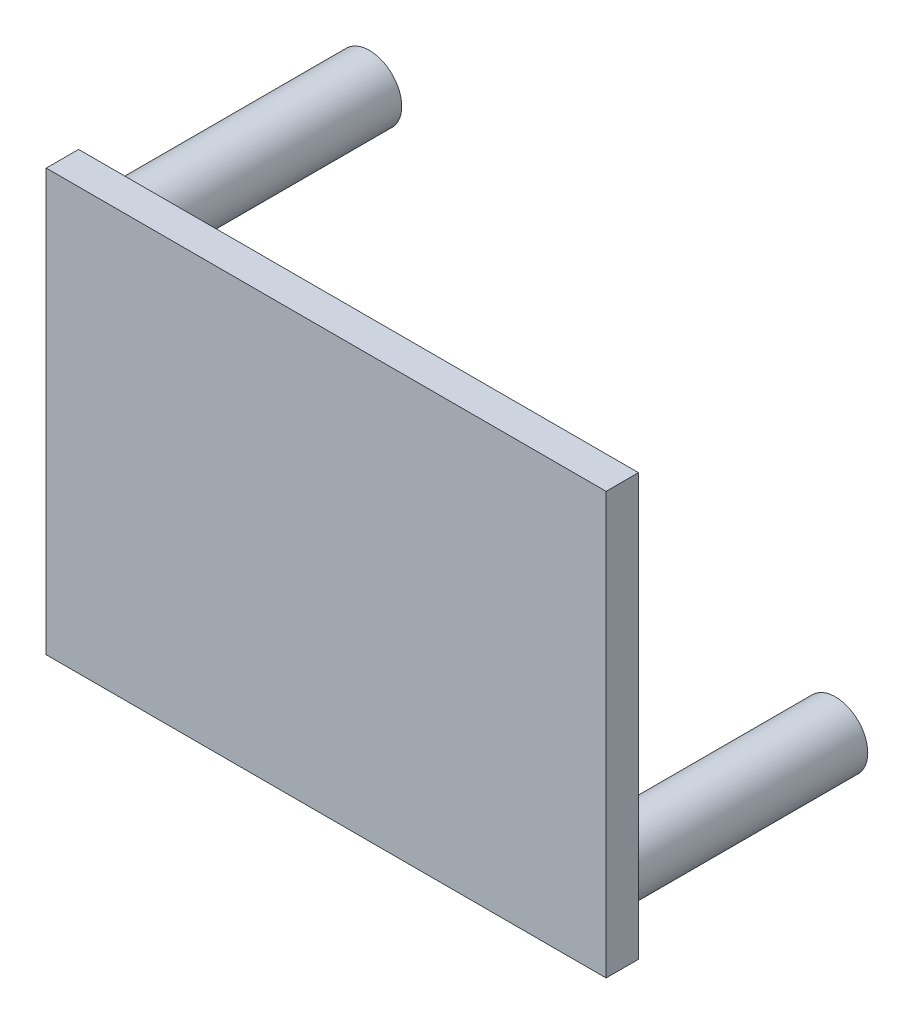
ISO-10303-21;
HEADER;
FILE_DESCRIPTION(('STEP AP214'),'2;1');
FILE_NAME('part.step','',(''),(''),'','','');
FILE_SCHEMA(('AUTOMOTIVE_DESIGN { 1 0 10303 214 1 1 1 1 }'));
ENDSEC;
DATA;
#1=APPLICATION_CONTEXT('core data for automotive mechanical design processes');
#2=APPLICATION_PROTOCOL_DEFINITION('international standard','automotive_design',2000,#1);
#3=PRODUCT_CONTEXT('',#1,'mechanical');
#4=PRODUCT('Part','Part','',(#3));
#5=PRODUCT_RELATED_PRODUCT_CATEGORY('part','',(#4));
#6=PRODUCT_DEFINITION_FORMATION('','',#4);
#7=PRODUCT_DEFINITION_CONTEXT('part definition',#1,'design');
#8=PRODUCT_DEFINITION('design','',#6,#7);
#9=PRODUCT_DEFINITION_SHAPE('','',#8);
#10=(LENGTH_UNIT() NAMED_UNIT(*) SI_UNIT(.MILLI.,.METRE.));
#11=(NAMED_UNIT(*) PLANE_ANGLE_UNIT() SI_UNIT($,.RADIAN.));
#12=(NAMED_UNIT(*) SI_UNIT($,.STERADIAN.) SOLID_ANGLE_UNIT());
#13=UNCERTAINTY_MEASURE_WITH_UNIT(LENGTH_MEASURE(1.E-05),#10,'distance_accuracy_value','');
#14=(GEOMETRIC_REPRESENTATION_CONTEXT(3) GLOBAL_UNCERTAINTY_ASSIGNED_CONTEXT((#13)) GLOBAL_UNIT_ASSIGNED_CONTEXT((#10,
#11,#12)) REPRESENTATION_CONTEXT('',''));
#15=CARTESIAN_POINT('',(0.,0.,0.));
#16=DIRECTION('',(0.,0.,1.));
#17=DIRECTION('',(1.,0.,0.));
#18=AXIS2_PLACEMENT_3D('',#15,#16,#17);
#19=CARTESIAN_POINT('',(0.,0.,-15.));
#20=DIRECTION('',(0.,0.,1.));
#21=DIRECTION('',(-1.,0.,0.));
#22=AXIS2_PLACEMENT_3D('',#19,#20,#21);
#23=CYLINDRICAL_SURFACE('',#22,2.);
#24=CARTESIAN_POINT('',(0.,0.,-15.));
#25=DIRECTION('',(0.,0.,1.));
#26=DIRECTION('',(1.,0.,0.));
#27=AXIS2_PLACEMENT_3D('',#24,#25,#26);
#28=CIRCLE('',#27,2.);
#29=CARTESIAN_POINT('',(2.,0.,-15.));
#30=VERTEX_POINT('',#29);
#31=EDGE_CURVE('E11',#30,#30,#28,.T.);
#32=ORIENTED_EDGE('',*,*,#31,.T.);
#33=EDGE_LOOP('',(#32));
#34=FACE_BOUND('',#33,.T.);
#35=CARTESIAN_POINT('',(0.,0.,0.));
#36=DIRECTION('',(0.,0.,1.));
#37=DIRECTION('',(1.,0.,0.));
#38=AXIS2_PLACEMENT_3D('',#35,#36,#37);
#39=CIRCLE('',#38,2.);
#40=CARTESIAN_POINT('',(2.,0.,0.));
#41=VERTEX_POINT('',#40);
#42=EDGE_CURVE('E38',#41,#41,#39,.T.);
#43=ORIENTED_EDGE('',*,*,#42,.F.);
#44=EDGE_LOOP('',(#43));
#45=FACE_BOUND('',#44,.T.);
#46=ADVANCED_FACE('F35',(#34,#45),#23,.T.);
#47=CARTESIAN_POINT('',(0.,0.,-15.));
#48=DIRECTION('',(0.,0.,-1.));
#49=DIRECTION('',(1.,0.,0.));
#50=AXIS2_PLACEMENT_3D('',#47,#48,#49);
#51=PLANE('',#50);
#52=ORIENTED_EDGE('',*,*,#31,.F.);
#53=EDGE_LOOP('',(#52));
#54=FACE_BOUND('',#53,.T.);
#55=ADVANCED_FACE('F132',(#54),#51,.T.);
#56=CARTESIAN_POINT('',(-2.96989764351004,2.71270956347711,2.));
#57=DIRECTION('',(-1.,0.,0.));
#58=DIRECTION('',(0.,0.,-1.));
#59=AXIS2_PLACEMENT_3D('',#56,#57,#58);
#60=PLANE('',#59);
#61=DIRECTION('',(0.,-1.,0.));
#62=VECTOR('',#61,1.);
#63=CARTESIAN_POINT('',(-2.96989764351004,2.71270956347711,0.));
#64=LINE('',#63,#62);
#65=CARTESIAN_POINT('',(-2.96989764351004,2.71270956347711,0.));
#66=VERTEX_POINT('',#65);
#67=CARTESIAN_POINT('',(-2.96989764351004,-23.3333730785571,0.));
#68=VERTEX_POINT('',#67);
#69=EDGE_CURVE('E101',#66,#68,#64,.T.);
#70=ORIENTED_EDGE('',*,*,#69,.T.);
#71=DIRECTION('',(0.,0.,-1.));
#72=VECTOR('',#71,1.);
#73=CARTESIAN_POINT('',(-2.96989764351004,-23.3333730785571,2.));
#74=LINE('',#73,#72);
#75=CARTESIAN_POINT('',(-2.96989764351004,-23.3333730785571,2.));
#76=VERTEX_POINT('',#75);
#77=EDGE_CURVE('E94',#76,#68,#74,.T.);
#78=ORIENTED_EDGE('',*,*,#77,.F.);
#79=DIRECTION('',(0.,-1.,0.));
#80=VECTOR('',#79,1.);
#81=CARTESIAN_POINT('',(-2.96989764351004,2.71270956347711,2.));
#82=LINE('',#81,#80);
#83=CARTESIAN_POINT('',(-2.96989764351004,2.71270956347711,2.));
#84=VERTEX_POINT('',#83);
#85=EDGE_CURVE('E87',#84,#76,#82,.T.);
#86=ORIENTED_EDGE('',*,*,#85,.F.);
#87=DIRECTION('',(0.,0.,-1.));
#88=VECTOR('',#87,1.);
#89=CARTESIAN_POINT('',(-2.96989764351004,2.71270956347711,2.));
#90=LINE('',#89,#88);
#91=EDGE_CURVE('E108',#84,#66,#90,.T.);
#92=ORIENTED_EDGE('',*,*,#91,.T.);
#93=EDGE_LOOP('',(#70,#78,#86,#92));
#94=FACE_BOUND('',#93,.T.);
#95=ADVANCED_FACE('F113',(#94),#60,.T.);
#96=CARTESIAN_POINT('',(-2.96989764351004,2.71270956347711,2.));
#97=DIRECTION('',(0.,1.,0.));
#98=DIRECTION('',(0.,0.,-1.));
#99=AXIS2_PLACEMENT_3D('',#96,#97,#98);
#100=PLANE('',#99);
#101=DIRECTION('',(-1.,0.,0.));
#102=VECTOR('',#101,1.);
#103=CARTESIAN_POINT('',(-2.96989764351004,2.71270956347711,0.));
#104=LINE('',#103,#102);
#105=CARTESIAN_POINT('',(31.6296764718167,2.71270956347711,0.));
#106=VERTEX_POINT('',#105);
#107=EDGE_CURVE('E74',#106,#66,#104,.T.);
#108=ORIENTED_EDGE('',*,*,#107,.T.);
#109=ORIENTED_EDGE('',*,*,#91,.F.);
#110=DIRECTION('',(-1.,0.,0.));
#111=VECTOR('',#110,1.);
#112=CARTESIAN_POINT('',(-2.96989764351004,2.71270956347711,2.));
#113=LINE('',#112,#111);
#114=CARTESIAN_POINT('',(31.6296764718167,2.71270956347711,2.));
#115=VERTEX_POINT('',#114);
#116=EDGE_CURVE('E51',#115,#84,#113,.T.);
#117=ORIENTED_EDGE('',*,*,#116,.F.);
#118=DIRECTION('',(0.,0.,-1.));
#119=VECTOR('',#118,1.);
#120=CARTESIAN_POINT('',(31.6296764718167,2.71270956347711,2.));
#121=LINE('',#120,#119);
#122=EDGE_CURVE('E93',#115,#106,#121,.T.);
#123=ORIENTED_EDGE('',*,*,#122,.T.);
#124=EDGE_LOOP('',(#108,#109,#117,#123));
#125=FACE_BOUND('',#124,.T.);
#126=ADVANCED_FACE('F145',(#125),#100,.T.);
#127=CARTESIAN_POINT('',(31.6296764718167,2.71270956347711,2.));
#128=DIRECTION('',(1.,0.,0.));
#129=DIRECTION('',(0.,0.,1.));
#130=AXIS2_PLACEMENT_3D('',#127,#128,#129);
#131=PLANE('',#130);
#132=DIRECTION('',(0.,1.,0.));
#133=VECTOR('',#132,1.);
#134=CARTESIAN_POINT('',(31.6296764718167,2.71270956347711,0.));
#135=LINE('',#134,#133);
#136=CARTESIAN_POINT('',(31.6296764718167,-23.3333730785571,0.));
#137=VERTEX_POINT('',#136);
#138=EDGE_CURVE('E68',#137,#106,#135,.T.);
#139=ORIENTED_EDGE('',*,*,#138,.T.);
#140=ORIENTED_EDGE('',*,*,#122,.F.);
#141=DIRECTION('',(0.,1.,0.));
#142=VECTOR('',#141,1.);
#143=CARTESIAN_POINT('',(31.6296764718167,2.71270956347711,2.));
#144=LINE('',#143,#142);
#145=CARTESIAN_POINT('',(31.6296764718167,-23.3333730785571,2.));
#146=VERTEX_POINT('',#145);
#147=EDGE_CURVE('E85',#146,#115,#144,.T.);
#148=ORIENTED_EDGE('',*,*,#147,.F.);
#149=DIRECTION('',(0.,0.,-1.));
#150=VECTOR('',#149,1.);
#151=CARTESIAN_POINT('',(31.6296764718167,-23.3333730785571,2.));
#152=LINE('',#151,#150);
#153=EDGE_CURVE('E90',#146,#137,#152,.T.);
#154=ORIENTED_EDGE('',*,*,#153,.T.);
#155=EDGE_LOOP('',(#139,#140,#148,#154));
#156=FACE_BOUND('',#155,.T.);
#157=ADVANCED_FACE('F96',(#156),#131,.T.);
#158=CARTESIAN_POINT('',(-2.96989764351004,-23.3333730785571,2.));
#159=DIRECTION('',(0.,-1.,0.));
#160=DIRECTION('',(0.,0.,1.));
#161=AXIS2_PLACEMENT_3D('',#158,#159,#160);
#162=PLANE('',#161);
#163=DIRECTION('',(1.,0.,0.));
#164=VECTOR('',#163,1.);
#165=CARTESIAN_POINT('',(-2.96989764351004,-23.3333730785571,0.));
#166=LINE('',#165,#164);
#167=EDGE_CURVE('E92',#68,#137,#166,.T.);
#168=ORIENTED_EDGE('',*,*,#167,.T.);
#169=ORIENTED_EDGE('',*,*,#153,.F.);
#170=DIRECTION('',(1.,0.,0.));
#171=VECTOR('',#170,1.);
#172=CARTESIAN_POINT('',(-2.96989764351004,-23.3333730785571,2.));
#173=LINE('',#172,#171);
#174=EDGE_CURVE('E82',#76,#146,#173,.T.);
#175=ORIENTED_EDGE('',*,*,#174,.F.);
#176=ORIENTED_EDGE('',*,*,#77,.T.);
#177=EDGE_LOOP('',(#168,#169,#175,#176));
#178=FACE_BOUND('',#177,.T.);
#179=ADVANCED_FACE('F91',(#178),#162,.T.);
#180=CARTESIAN_POINT('',(0.,0.,2.));
#181=DIRECTION('',(0.,0.,-1.));
#182=DIRECTION('',(1.,0.,0.));
#183=AXIS2_PLACEMENT_3D('',#180,#181,#182);
#184=PLANE('',#183);
#185=ORIENTED_EDGE('',*,*,#85,.T.);
#186=ORIENTED_EDGE('',*,*,#174,.T.);
#187=ORIENTED_EDGE('',*,*,#147,.T.);
#188=ORIENTED_EDGE('',*,*,#116,.T.);
#189=EDGE_LOOP('',(#185,#186,#187,#188));
#190=FACE_BOUND('',#189,.T.);
#191=ADVANCED_FACE('F83',(#190),#184,.F.);
#192=CARTESIAN_POINT('',(0.,0.,0.));
#193=DIRECTION('',(0.,0.,-1.));
#194=DIRECTION('',(1.,0.,0.));
#195=AXIS2_PLACEMENT_3D('',#192,#193,#194);
#196=PLANE('',#195);
#197=CARTESIAN_POINT('',(28.8,-20.2,0.));
#198=DIRECTION('',(0.,0.,1.));
#199=DIRECTION('',(1.,0.,0.));
#200=AXIS2_PLACEMENT_3D('',#197,#198,#199);
#201=CIRCLE('',#200,2.);
#202=CARTESIAN_POINT('',(30.8,-20.2,0.));
#203=VERTEX_POINT('',#202);
#204=EDGE_CURVE('E193',#203,#203,#201,.T.);
#205=ORIENTED_EDGE('',*,*,#204,.T.);
#206=EDGE_LOOP('',(#205));
#207=FACE_BOUND('',#206,.T.);
#208=ORIENTED_EDGE('',*,*,#42,.T.);
#209=EDGE_LOOP('',(#208));
#210=FACE_BOUND('',#209,.T.);
#211=ORIENTED_EDGE('',*,*,#69,.F.);
#212=ORIENTED_EDGE('',*,*,#107,.F.);
#213=ORIENTED_EDGE('',*,*,#138,.F.);
#214=ORIENTED_EDGE('',*,*,#167,.F.);
#215=EDGE_LOOP('',(#211,#212,#213,#214));
#216=FACE_BOUND('',#215,.T.);
#217=ADVANCED_FACE('F115',(#207,#210,#216),#196,.T.);
#218=CARTESIAN_POINT('',(28.8,-20.2,-15.));
#219=DIRECTION('',(0.,0.,1.));
#220=DIRECTION('',(-1.,0.,0.));
#221=AXIS2_PLACEMENT_3D('',#218,#219,#220);
#222=CYLINDRICAL_SURFACE('',#221,2.);
#223=CARTESIAN_POINT('',(28.8,-20.2,-15.));
#224=DIRECTION('',(0.,0.,1.));
#225=DIRECTION('',(1.,0.,0.));
#226=AXIS2_PLACEMENT_3D('',#223,#224,#225);
#227=CIRCLE('',#226,2.);
#228=CARTESIAN_POINT('',(30.8,-20.2,-15.));
#229=VERTEX_POINT('',#228);
#230=EDGE_CURVE('E104',#229,#229,#227,.T.);
#231=ORIENTED_EDGE('',*,*,#230,.T.);
#232=EDGE_LOOP('',(#231));
#233=FACE_BOUND('',#232,.T.);
#234=ORIENTED_EDGE('',*,*,#204,.F.);
#235=EDGE_LOOP('',(#234));
#236=FACE_BOUND('',#235,.T.);
#237=ADVANCED_FACE('F117',(#233,#236),#222,.T.);
#238=CARTESIAN_POINT('',(28.8,-20.2,-15.));
#239=DIRECTION('',(0.,0.,-1.));
#240=DIRECTION('',(1.,0.,0.));
#241=AXIS2_PLACEMENT_3D('',#238,#239,#240);
#242=PLANE('',#241);
#243=ORIENTED_EDGE('',*,*,#230,.F.);
#244=EDGE_LOOP('',(#243));
#245=FACE_BOUND('',#244,.T.);
#246=ADVANCED_FACE('F124',(#245),#242,.T.);
#247=CLOSED_SHELL('',(#46,#55,#95,#126,#157,#179,#191,#217,#237,#246));
#248=MANIFOLD_SOLID_BREP('B2',#247);
#249=ADVANCED_BREP_SHAPE_REPRESENTATION('',(#18,#248),#14);
#250=SHAPE_DEFINITION_REPRESENTATION(#9,#249);
ENDSEC;
END-ISO-10303-21;
